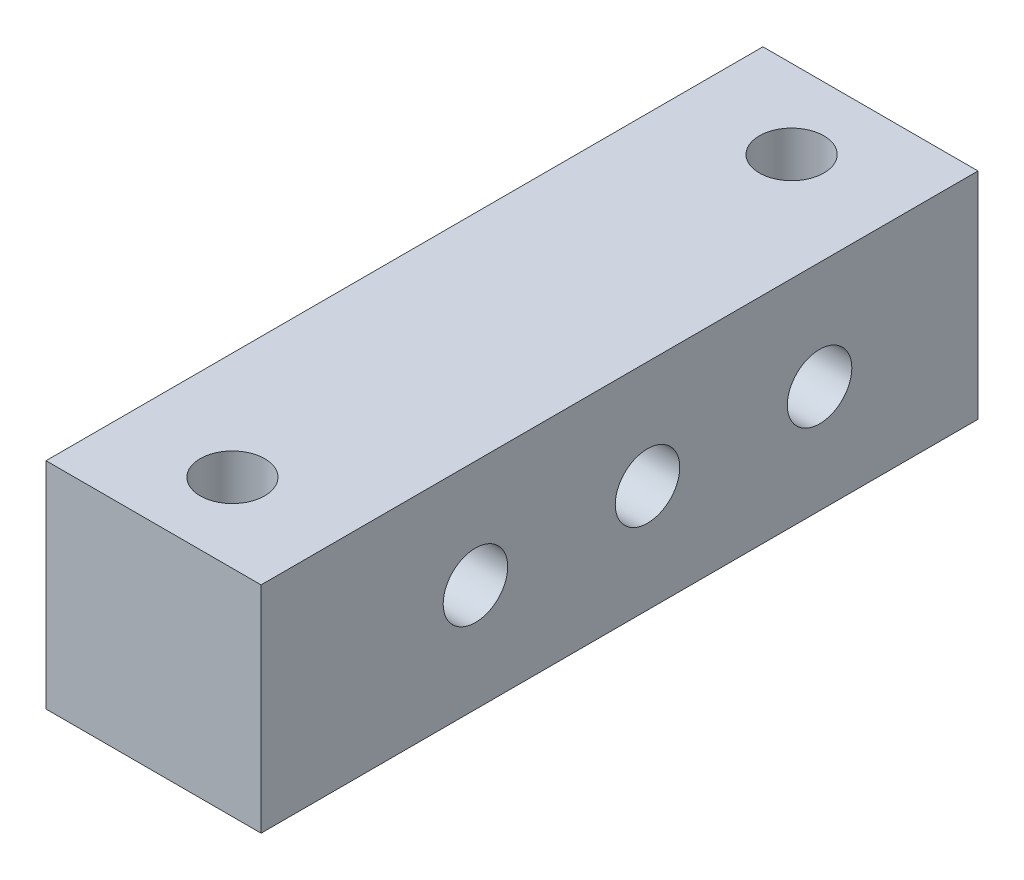
ISO-10303-21;
HEADER;
FILE_DESCRIPTION(('STEP AP214'),'2;1');
FILE_NAME('part.step','',(''),(''),'','','');
FILE_SCHEMA(('AUTOMOTIVE_DESIGN { 1 0 10303 214 1 1 1 1 }'));
ENDSEC;
DATA;
#1=APPLICATION_CONTEXT('core data for automotive mechanical design processes');
#2=APPLICATION_PROTOCOL_DEFINITION('international standard','automotive_design',2000,#1);
#3=PRODUCT_CONTEXT('',#1,'mechanical');
#4=PRODUCT('Part','Part','',(#3));
#5=PRODUCT_RELATED_PRODUCT_CATEGORY('part','',(#4));
#6=PRODUCT_DEFINITION_FORMATION('','',#4);
#7=PRODUCT_DEFINITION_CONTEXT('part definition',#1,'design');
#8=PRODUCT_DEFINITION('design','',#6,#7);
#9=PRODUCT_DEFINITION_SHAPE('','',#8);
#10=(LENGTH_UNIT() NAMED_UNIT(*) SI_UNIT(.MILLI.,.METRE.));
#11=(NAMED_UNIT(*) PLANE_ANGLE_UNIT() SI_UNIT($,.RADIAN.));
#12=(NAMED_UNIT(*) SI_UNIT($,.STERADIAN.) SOLID_ANGLE_UNIT());
#13=UNCERTAINTY_MEASURE_WITH_UNIT(LENGTH_MEASURE(1.E-05),#10,'distance_accuracy_value','');
#14=(GEOMETRIC_REPRESENTATION_CONTEXT(3) GLOBAL_UNCERTAINTY_ASSIGNED_CONTEXT((#13)) GLOBAL_UNIT_ASSIGNED_CONTEXT((#10,
#11,#12)) REPRESENTATION_CONTEXT('',''));
#15=CARTESIAN_POINT('',(0.,0.,0.));
#16=DIRECTION('',(0.,0.,1.));
#17=DIRECTION('',(1.,0.,0.));
#18=AXIS2_PLACEMENT_3D('',#15,#16,#17);
#19=CARTESIAN_POINT('',(0.,0.,50.));
#20=DIRECTION('',(1.,0.,0.));
#21=DIRECTION('',(0.,0.,-1.));
#22=AXIS2_PLACEMENT_3D('',#19,#20,#21);
#23=PLANE('',#22);
#24=CARTESIAN_POINT('',(0.,7.5,35.05));
#25=DIRECTION('',(-1.,0.,0.));
#26=DIRECTION('',(0.,0.,1.));
#27=AXIS2_PLACEMENT_3D('',#24,#25,#26);
#28=CIRCLE('',#27,2.25);
#29=CARTESIAN_POINT('',(0.,7.5,37.3));
#30=VERTEX_POINT('',#29);
#31=EDGE_CURVE('E134',#30,#30,#28,.T.);
#32=ORIENTED_EDGE('',*,*,#31,.F.);
#33=EDGE_LOOP('',(#32));
#34=FACE_BOUND('',#33,.T.);
#35=CARTESIAN_POINT('',(0.,7.5,11.05));
#36=DIRECTION('',(-1.,0.,0.));
#37=DIRECTION('',(0.,0.,-1.));
#38=AXIS2_PLACEMENT_3D('',#35,#36,#37);
#39=CIRCLE('',#38,2.25);
#40=CARTESIAN_POINT('',(0.,7.5,8.8));
#41=VERTEX_POINT('',#40);
#42=EDGE_CURVE('E128',#41,#41,#39,.T.);
#43=ORIENTED_EDGE('',*,*,#42,.F.);
#44=EDGE_LOOP('',(#43));
#45=FACE_BOUND('',#44,.T.);
#46=CARTESIAN_POINT('',(0.,7.5,23.05));
#47=DIRECTION('',(-1.,0.,0.));
#48=DIRECTION('',(0.,0.,1.));
#49=AXIS2_PLACEMENT_3D('',#46,#47,#48);
#50=CIRCLE('',#49,2.25);
#51=CARTESIAN_POINT('',(0.,7.5,25.3));
#52=VERTEX_POINT('',#51);
#53=EDGE_CURVE('E122',#52,#52,#50,.T.);
#54=ORIENTED_EDGE('',*,*,#53,.F.);
#55=EDGE_LOOP('',(#54));
#56=FACE_BOUND('',#55,.T.);
#57=DIRECTION('',(0.,-1.,0.));
#58=VECTOR('',#57,1.);
#59=CARTESIAN_POINT('',(0.,0.,0.));
#60=LINE('',#59,#58);
#61=CARTESIAN_POINT('',(0.,15.,0.));
#62=VERTEX_POINT('',#61);
#63=CARTESIAN_POINT('',(0.,0.,0.));
#64=VERTEX_POINT('',#63);
#65=EDGE_CURVE('E96',#62,#64,#60,.T.);
#66=ORIENTED_EDGE('',*,*,#65,.T.);
#67=DIRECTION('',(0.,0.,-1.));
#68=VECTOR('',#67,1.);
#69=CARTESIAN_POINT('',(0.,0.,50.));
#70=LINE('',#69,#68);
#71=CARTESIAN_POINT('',(0.,0.,50.));
#72=VERTEX_POINT('',#71);
#73=EDGE_CURVE('E11',#72,#64,#70,.T.);
#74=ORIENTED_EDGE('',*,*,#73,.F.);
#75=DIRECTION('',(0.,-1.,0.));
#76=VECTOR('',#75,1.);
#77=CARTESIAN_POINT('',(0.,0.,50.));
#78=LINE('',#77,#76);
#79=CARTESIAN_POINT('',(0.,15.,50.));
#80=VERTEX_POINT('',#79);
#81=EDGE_CURVE('E84',#80,#72,#78,.T.);
#82=ORIENTED_EDGE('',*,*,#81,.F.);
#83=DIRECTION('',(0.,0.,-1.));
#84=VECTOR('',#83,1.);
#85=CARTESIAN_POINT('',(0.,15.,50.));
#86=LINE('',#85,#84);
#87=EDGE_CURVE('E92',#80,#62,#86,.T.);
#88=ORIENTED_EDGE('',*,*,#87,.T.);
#89=EDGE_LOOP('',(#66,#74,#82,#88));
#90=FACE_BOUND('',#89,.T.);
#91=ADVANCED_FACE('F33',(#34,#45,#56,#90),#23,.F.);
#92=CARTESIAN_POINT('',(0.,0.,50.));
#93=DIRECTION('',(0.,1.,0.));
#94=DIRECTION('',(0.,0.,1.));
#95=AXIS2_PLACEMENT_3D('',#92,#93,#94);
#96=PLANE('',#95);
#97=CARTESIAN_POINT('',(7.49999999999999,0.,5.50000000000001));
#98=DIRECTION('',(0.,1.,0.));
#99=DIRECTION('',(0.,0.,-1.));
#100=AXIS2_PLACEMENT_3D('',#97,#98,#99);
#101=CIRCLE('',#100,2.25000000000001);
#102=CARTESIAN_POINT('',(7.49999999999999,0.,3.25));
#103=VERTEX_POINT('',#102);
#104=EDGE_CURVE('E113',#103,#103,#101,.T.);
#105=ORIENTED_EDGE('',*,*,#104,.T.);
#106=EDGE_LOOP('',(#105));
#107=FACE_BOUND('',#106,.T.);
#108=CARTESIAN_POINT('',(7.5,0.,44.5));
#109=DIRECTION('',(0.,1.,0.));
#110=DIRECTION('',(0.,0.,1.));
#111=AXIS2_PLACEMENT_3D('',#108,#109,#110);
#112=CIRCLE('',#111,2.25);
#113=CARTESIAN_POINT('',(7.5,0.,46.75));
#114=VERTEX_POINT('',#113);
#115=EDGE_CURVE('E99',#114,#114,#112,.T.);
#116=ORIENTED_EDGE('',*,*,#115,.T.);
#117=EDGE_LOOP('',(#116));
#118=FACE_BOUND('',#117,.T.);
#119=DIRECTION('',(1.,0.,0.));
#120=VECTOR('',#119,1.);
#121=CARTESIAN_POINT('',(0.,0.,0.));
#122=LINE('',#121,#120);
#123=CARTESIAN_POINT('',(15.,0.,0.));
#124=VERTEX_POINT('',#123);
#125=EDGE_CURVE('E88',#64,#124,#122,.T.);
#126=ORIENTED_EDGE('',*,*,#125,.T.);
#127=DIRECTION('',(0.,0.,-1.));
#128=VECTOR('',#127,1.);
#129=CARTESIAN_POINT('',(15.,0.,50.));
#130=LINE('',#129,#128);
#131=CARTESIAN_POINT('',(15.,0.,50.));
#132=VERTEX_POINT('',#131);
#133=EDGE_CURVE('E41',#132,#124,#130,.T.);
#134=ORIENTED_EDGE('',*,*,#133,.F.);
#135=DIRECTION('',(1.,0.,0.));
#136=VECTOR('',#135,1.);
#137=CARTESIAN_POINT('',(0.,0.,50.));
#138=LINE('',#137,#136);
#139=EDGE_CURVE('E79',#72,#132,#138,.T.);
#140=ORIENTED_EDGE('',*,*,#139,.F.);
#141=ORIENTED_EDGE('',*,*,#73,.T.);
#142=EDGE_LOOP('',(#126,#134,#140,#141));
#143=FACE_BOUND('',#142,.T.);
#144=ADVANCED_FACE('F87',(#107,#118,#143),#96,.F.);
#145=CARTESIAN_POINT('',(15.,0.,50.));
#146=DIRECTION('',(-1.,0.,0.));
#147=DIRECTION('',(0.,0.,1.));
#148=AXIS2_PLACEMENT_3D('',#145,#146,#147);
#149=PLANE('',#148);
#150=CARTESIAN_POINT('',(15.,7.5,35.05));
#151=DIRECTION('',(-1.,0.,0.));
#152=DIRECTION('',(0.,0.,1.));
#153=AXIS2_PLACEMENT_3D('',#150,#151,#152);
#154=CIRCLE('',#153,2.25);
#155=CARTESIAN_POINT('',(15.,7.5,37.3));
#156=VERTEX_POINT('',#155);
#157=EDGE_CURVE('E125',#156,#156,#154,.T.);
#158=ORIENTED_EDGE('',*,*,#157,.T.);
#159=EDGE_LOOP('',(#158));
#160=FACE_BOUND('',#159,.T.);
#161=CARTESIAN_POINT('',(15.,7.5,11.05));
#162=DIRECTION('',(-1.,0.,0.));
#163=DIRECTION('',(0.,0.,-1.));
#164=AXIS2_PLACEMENT_3D('',#161,#162,#163);
#165=CIRCLE('',#164,2.25);
#166=CARTESIAN_POINT('',(15.,7.5,8.8));
#167=VERTEX_POINT('',#166);
#168=EDGE_CURVE('E131',#167,#167,#165,.T.);
#169=ORIENTED_EDGE('',*,*,#168,.T.);
#170=EDGE_LOOP('',(#169));
#171=FACE_BOUND('',#170,.T.);
#172=CARTESIAN_POINT('',(15.,7.5,23.05));
#173=DIRECTION('',(-1.,0.,0.));
#174=DIRECTION('',(0.,0.,1.));
#175=AXIS2_PLACEMENT_3D('',#172,#173,#174);
#176=CIRCLE('',#175,2.25);
#177=CARTESIAN_POINT('',(15.,7.5,25.3));
#178=VERTEX_POINT('',#177);
#179=EDGE_CURVE('E119',#178,#178,#176,.T.);
#180=ORIENTED_EDGE('',*,*,#179,.T.);
#181=EDGE_LOOP('',(#180));
#182=FACE_BOUND('',#181,.T.);
#183=DIRECTION('',(0.,1.,0.));
#184=VECTOR('',#183,1.);
#185=CARTESIAN_POINT('',(15.,0.,0.));
#186=LINE('',#185,#184);
#187=CARTESIAN_POINT('',(15.,15.,0.));
#188=VERTEX_POINT('',#187);
#189=EDGE_CURVE('E66',#124,#188,#186,.T.);
#190=ORIENTED_EDGE('',*,*,#189,.T.);
#191=DIRECTION('',(0.,0.,-1.));
#192=VECTOR('',#191,1.);
#193=CARTESIAN_POINT('',(15.,15.,50.));
#194=LINE('',#193,#192);
#195=CARTESIAN_POINT('',(15.,15.,50.));
#196=VERTEX_POINT('',#195);
#197=EDGE_CURVE('E89',#196,#188,#194,.T.);
#198=ORIENTED_EDGE('',*,*,#197,.F.);
#199=DIRECTION('',(0.,1.,0.));
#200=VECTOR('',#199,1.);
#201=CARTESIAN_POINT('',(15.,0.,50.));
#202=LINE('',#201,#200);
#203=EDGE_CURVE('E82',#132,#196,#202,.T.);
#204=ORIENTED_EDGE('',*,*,#203,.F.);
#205=ORIENTED_EDGE('',*,*,#133,.T.);
#206=EDGE_LOOP('',(#190,#198,#204,#205));
#207=FACE_BOUND('',#206,.T.);
#208=ADVANCED_FACE('F90',(#160,#171,#182,#207),#149,.F.);
#209=CARTESIAN_POINT('',(0.,15.,50.));
#210=DIRECTION('',(0.,-1.,0.));
#211=DIRECTION('',(0.,0.,-1.));
#212=AXIS2_PLACEMENT_3D('',#209,#210,#211);
#213=PLANE('',#212);
#214=CARTESIAN_POINT('',(7.49999999999999,15.,5.50000000000001));
#215=DIRECTION('',(0.,1.,0.));
#216=DIRECTION('',(0.,0.,-1.));
#217=AXIS2_PLACEMENT_3D('',#214,#215,#216);
#218=CIRCLE('',#217,2.25000000000001);
#219=CARTESIAN_POINT('',(7.49999999999999,15.,3.25));
#220=VERTEX_POINT('',#219);
#221=EDGE_CURVE('E116',#220,#220,#218,.T.);
#222=ORIENTED_EDGE('',*,*,#221,.F.);
#223=EDGE_LOOP('',(#222));
#224=FACE_BOUND('',#223,.T.);
#225=CARTESIAN_POINT('',(7.5,15.,44.5));
#226=DIRECTION('',(0.,1.,0.));
#227=DIRECTION('',(0.,0.,1.));
#228=AXIS2_PLACEMENT_3D('',#225,#226,#227);
#229=CIRCLE('',#228,2.25);
#230=CARTESIAN_POINT('',(7.5,15.,46.75));
#231=VERTEX_POINT('',#230);
#232=EDGE_CURVE('E110',#231,#231,#229,.T.);
#233=ORIENTED_EDGE('',*,*,#232,.F.);
#234=EDGE_LOOP('',(#233));
#235=FACE_BOUND('',#234,.T.);
#236=DIRECTION('',(-1.,0.,0.));
#237=VECTOR('',#236,1.);
#238=CARTESIAN_POINT('',(0.,15.,0.));
#239=LINE('',#238,#237);
#240=EDGE_CURVE('E72',#188,#62,#239,.T.);
#241=ORIENTED_EDGE('',*,*,#240,.T.);
#242=ORIENTED_EDGE('',*,*,#87,.F.);
#243=DIRECTION('',(-1.,0.,0.));
#244=VECTOR('',#243,1.);
#245=CARTESIAN_POINT('',(0.,15.,50.));
#246=LINE('',#245,#244);
#247=EDGE_CURVE('E49',#196,#80,#246,.T.);
#248=ORIENTED_EDGE('',*,*,#247,.F.);
#249=ORIENTED_EDGE('',*,*,#197,.T.);
#250=EDGE_LOOP('',(#241,#242,#248,#249));
#251=FACE_BOUND('',#250,.T.);
#252=ADVANCED_FACE('F104',(#224,#235,#251),#213,.F.);
#253=CARTESIAN_POINT('',(0.,0.,50.));
#254=DIRECTION('',(0.,0.,-1.));
#255=DIRECTION('',(-1.,0.,0.));
#256=AXIS2_PLACEMENT_3D('',#253,#254,#255);
#257=PLANE('',#256);
#258=ORIENTED_EDGE('',*,*,#81,.T.);
#259=ORIENTED_EDGE('',*,*,#139,.T.);
#260=ORIENTED_EDGE('',*,*,#203,.T.);
#261=ORIENTED_EDGE('',*,*,#247,.T.);
#262=EDGE_LOOP('',(#258,#259,#260,#261));
#263=FACE_BOUND('',#262,.T.);
#264=ADVANCED_FACE('F80',(#263),#257,.F.);
#265=CARTESIAN_POINT('',(0.,0.,0.));
#266=DIRECTION('',(0.,0.,-1.));
#267=DIRECTION('',(-1.,0.,0.));
#268=AXIS2_PLACEMENT_3D('',#265,#266,#267);
#269=PLANE('',#268);
#270=ORIENTED_EDGE('',*,*,#65,.F.);
#271=ORIENTED_EDGE('',*,*,#240,.F.);
#272=ORIENTED_EDGE('',*,*,#189,.F.);
#273=ORIENTED_EDGE('',*,*,#125,.F.);
#274=EDGE_LOOP('',(#270,#271,#272,#273));
#275=FACE_BOUND('',#274,.T.);
#276=ADVANCED_FACE('F107',(#275),#269,.T.);
#277=CARTESIAN_POINT('',(7.5,0.,44.5));
#278=DIRECTION('',(0.,1.,0.));
#279=DIRECTION('',(0.,0.,1.));
#280=AXIS2_PLACEMENT_3D('',#277,#278,#279);
#281=CYLINDRICAL_SURFACE('',#280,2.25);
#282=ORIENTED_EDGE('',*,*,#115,.F.);
#283=EDGE_LOOP('',(#282));
#284=FACE_BOUND('',#283,.T.);
#285=ORIENTED_EDGE('',*,*,#232,.T.);
#286=EDGE_LOOP('',(#285));
#287=FACE_BOUND('',#286,.T.);
#288=ADVANCED_FACE('F166',(#284,#287),#281,.F.);
#289=CARTESIAN_POINT('',(7.49999999999999,0.,5.50000000000001));
#290=DIRECTION('',(0.,1.,0.));
#291=DIRECTION('',(0.,0.,1.));
#292=AXIS2_PLACEMENT_3D('',#289,#290,#291);
#293=CYLINDRICAL_SURFACE('',#292,2.25000000000001);
#294=ORIENTED_EDGE('',*,*,#104,.F.);
#295=EDGE_LOOP('',(#294));
#296=FACE_BOUND('',#295,.T.);
#297=ORIENTED_EDGE('',*,*,#221,.T.);
#298=EDGE_LOOP('',(#297));
#299=FACE_BOUND('',#298,.T.);
#300=ADVANCED_FACE('F157',(#296,#299),#293,.F.);
#301=CARTESIAN_POINT('',(15.,7.5,23.05));
#302=DIRECTION('',(-1.,0.,0.));
#303=DIRECTION('',(0.,0.,1.));
#304=AXIS2_PLACEMENT_3D('',#301,#302,#303);
#305=CYLINDRICAL_SURFACE('',#304,2.25);
#306=ORIENTED_EDGE('',*,*,#179,.F.);
#307=EDGE_LOOP('',(#306));
#308=FACE_BOUND('',#307,.T.);
#309=ORIENTED_EDGE('',*,*,#53,.T.);
#310=EDGE_LOOP('',(#309));
#311=FACE_BOUND('',#310,.T.);
#312=ADVANCED_FACE('F155',(#308,#311),#305,.F.);
#313=CARTESIAN_POINT('',(15.,7.5,11.05));
#314=DIRECTION('',(-1.,0.,0.));
#315=DIRECTION('',(0.,0.,1.));
#316=AXIS2_PLACEMENT_3D('',#313,#314,#315);
#317=CYLINDRICAL_SURFACE('',#316,2.25);
#318=ORIENTED_EDGE('',*,*,#168,.F.);
#319=EDGE_LOOP('',(#318));
#320=FACE_BOUND('',#319,.T.);
#321=ORIENTED_EDGE('',*,*,#42,.T.);
#322=EDGE_LOOP('',(#321));
#323=FACE_BOUND('',#322,.T.);
#324=ADVANCED_FACE('F145',(#320,#323),#317,.F.);
#325=CARTESIAN_POINT('',(15.,7.5,35.05));
#326=DIRECTION('',(-1.,0.,0.));
#327=DIRECTION('',(0.,0.,1.));
#328=AXIS2_PLACEMENT_3D('',#325,#326,#327);
#329=CYLINDRICAL_SURFACE('',#328,2.25);
#330=ORIENTED_EDGE('',*,*,#157,.F.);
#331=EDGE_LOOP('',(#330));
#332=FACE_BOUND('',#331,.T.);
#333=ORIENTED_EDGE('',*,*,#31,.T.);
#334=EDGE_LOOP('',(#333));
#335=FACE_BOUND('',#334,.T.);
#336=ADVANCED_FACE('F142',(#332,#335),#329,.F.);
#337=CLOSED_SHELL('',(#91,#144,#208,#252,#264,#276,#288,#300,#312,#324,#336));
#338=MANIFOLD_SOLID_BREP('B2',#337);
#339=ADVANCED_BREP_SHAPE_REPRESENTATION('',(#18,#338),#14);
#340=SHAPE_DEFINITION_REPRESENTATION(#9,#339);
ENDSEC;
END-ISO-10303-21;
